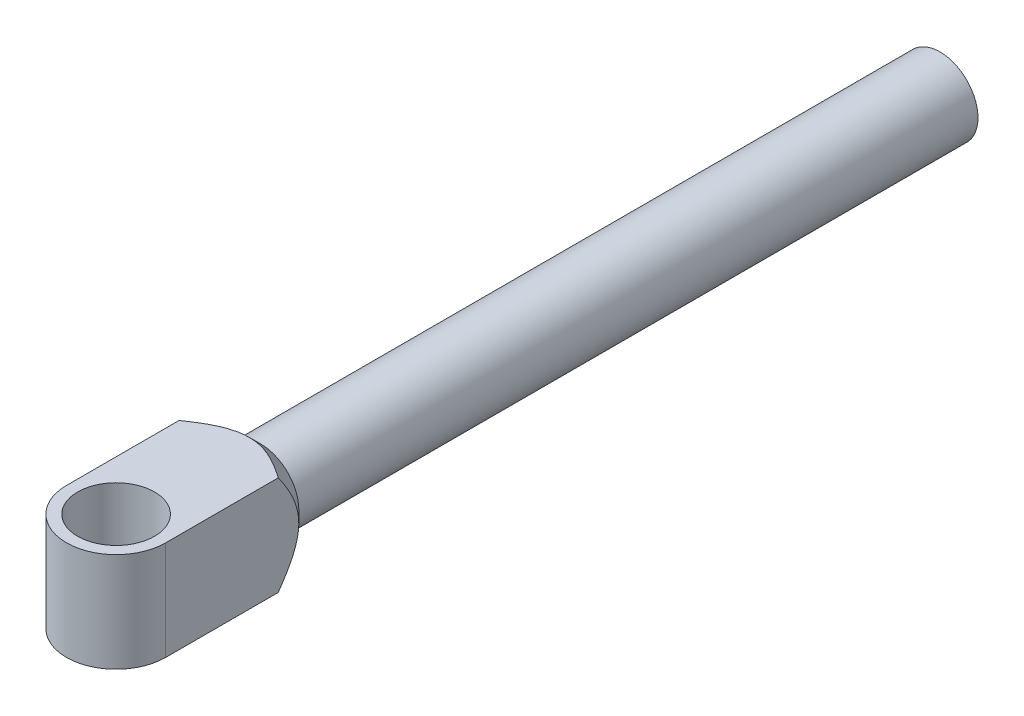
ISO-10303-21;
HEADER;
FILE_DESCRIPTION(('STEP AP214'),'2;1');
FILE_NAME('part.step','',(''),(''),'','','');
FILE_SCHEMA(('AUTOMOTIVE_DESIGN { 1 0 10303 214 1 1 1 1 }'));
ENDSEC;
DATA;
#1=APPLICATION_CONTEXT('core data for automotive mechanical design processes');
#2=APPLICATION_PROTOCOL_DEFINITION('international standard','automotive_design',2000,#1);
#3=PRODUCT_CONTEXT('',#1,'mechanical');
#4=PRODUCT('Part','Part','',(#3));
#5=PRODUCT_RELATED_PRODUCT_CATEGORY('part','',(#4));
#6=PRODUCT_DEFINITION_FORMATION('','',#4);
#7=PRODUCT_DEFINITION_CONTEXT('part definition',#1,'design');
#8=PRODUCT_DEFINITION('design','',#6,#7);
#9=PRODUCT_DEFINITION_SHAPE('','',#8);
#10=(LENGTH_UNIT() NAMED_UNIT(*) SI_UNIT(.MILLI.,.METRE.));
#11=(NAMED_UNIT(*) PLANE_ANGLE_UNIT() SI_UNIT($,.RADIAN.));
#12=(NAMED_UNIT(*) SI_UNIT($,.STERADIAN.) SOLID_ANGLE_UNIT());
#13=UNCERTAINTY_MEASURE_WITH_UNIT(LENGTH_MEASURE(1.E-05),#10,'distance_accuracy_value','');
#14=(GEOMETRIC_REPRESENTATION_CONTEXT(3) GLOBAL_UNCERTAINTY_ASSIGNED_CONTEXT((#13)) GLOBAL_UNIT_ASSIGNED_CONTEXT((#10,
#11,#12)) REPRESENTATION_CONTEXT('',''));
#15=CARTESIAN_POINT('',(0.,0.,0.));
#16=DIRECTION('',(0.,0.,1.));
#17=DIRECTION('',(1.,0.,0.));
#18=AXIS2_PLACEMENT_3D('',#15,#16,#17);
#19=CARTESIAN_POINT('',(356.0840273377,-43.807887528,805.25));
#20=DIRECTION('',(0.,1.,0.));
#21=DIRECTION('',(0.,0.,1.));
#22=AXIS2_PLACEMENT_3D('',#19,#20,#21);
#23=CYLINDRICAL_SURFACE('',#22,11.75);
#24=DIRECTION('',(0.,1.,0.));
#25=VECTOR('',#24,1.);
#26=CARTESIAN_POINT('',(344.3340273377,-43.807887528,805.25));
#27=LINE('',#26,#25);
#28=CARTESIAN_POINT('',(344.3340273377,-67.307887528,805.25));
#29=VERTEX_POINT('',#28);
#30=CARTESIAN_POINT('',(344.3340273377,-43.807887528,805.25));
#31=VERTEX_POINT('',#30);
#32=EDGE_CURVE('E62',#29,#31,#27,.T.);
#33=ORIENTED_EDGE('',*,*,#32,.F.);
#34=CARTESIAN_POINT('',(356.0840273377,-67.307887528,805.25));
#35=DIRECTION('',(0.,1.,0.));
#36=DIRECTION('',(0.,0.,1.));
#37=AXIS2_PLACEMENT_3D('',#34,#35,#36);
#38=CIRCLE('',#37,11.75);
#39=CARTESIAN_POINT('',(367.8340273377,-67.307887528,805.25));
#40=VERTEX_POINT('',#39);
#41=EDGE_CURVE('E20',#40,#29,#38,.F.);
#42=ORIENTED_EDGE('',*,*,#41,.F.);
#43=DIRECTION('',(0.,1.,0.));
#44=VECTOR('',#43,1.);
#45=CARTESIAN_POINT('',(367.8340273377,-43.807887528,805.25));
#46=LINE('',#45,#44);
#47=CARTESIAN_POINT('',(367.8340273377,-43.807887528,805.25));
#48=VERTEX_POINT('',#47);
#49=EDGE_CURVE('E60',#48,#40,#46,.F.);
#50=ORIENTED_EDGE('',*,*,#49,.F.);
#51=CARTESIAN_POINT('',(356.0840273377,-43.807887528,805.25));
#52=DIRECTION('',(0.,1.,0.));
#53=DIRECTION('',(0.,0.,1.));
#54=AXIS2_PLACEMENT_3D('',#51,#52,#53);
#55=CIRCLE('',#54,11.75);
#56=EDGE_CURVE('E146',#48,#31,#55,.F.);
#57=ORIENTED_EDGE('',*,*,#56,.T.);
#58=EDGE_LOOP('',(#33,#42,#50,#57));
#59=FACE_BOUND('',#58,.T.);
#60=ADVANCED_FACE('F17',(#59),#23,.T.);
#61=CARTESIAN_POINT('',(356.0840273377,-43.807887528,805.25));
#62=DIRECTION('',(0.,1.,0.));
#63=DIRECTION('',(0.,0.,1.));
#64=AXIS2_PLACEMENT_3D('',#61,#62,#63);
#65=CYLINDRICAL_SURFACE('',#64,9.1);
#66=CARTESIAN_POINT('',(356.0840273377,-43.807887528,805.25));
#67=DIRECTION('',(0.,1.,0.));
#68=DIRECTION('',(0.,0.,1.));
#69=AXIS2_PLACEMENT_3D('',#66,#67,#68);
#70=CIRCLE('',#69,9.1);
#71=CARTESIAN_POINT('',(356.0840273377,-43.807887528,814.35));
#72=VERTEX_POINT('',#71);
#73=EDGE_CURVE('E115',#72,#72,#70,.T.);
#74=ORIENTED_EDGE('',*,*,#73,.T.);
#75=EDGE_LOOP('',(#74));
#76=FACE_BOUND('',#75,.T.);
#77=CARTESIAN_POINT('',(356.0840273377,-67.307887528,805.25));
#78=DIRECTION('',(0.,1.,0.));
#79=DIRECTION('',(0.,0.,1.));
#80=AXIS2_PLACEMENT_3D('',#77,#78,#79);
#81=CIRCLE('',#80,9.1);
#82=CARTESIAN_POINT('',(356.0840273377,-67.307887528,814.35));
#83=VERTEX_POINT('',#82);
#84=EDGE_CURVE('E64',#83,#83,#81,.T.);
#85=ORIENTED_EDGE('',*,*,#84,.F.);
#86=EDGE_LOOP('',(#85));
#87=FACE_BOUND('',#86,.T.);
#88=ADVANCED_FACE('F123',(#76,#87),#65,.F.);
#89=CARTESIAN_POINT('',(367.8340273377,-43.807887528,771.));
#90=DIRECTION('',(1.,0.,0.));
#91=DIRECTION('',(0.,0.,-1.));
#92=AXIS2_PLACEMENT_3D('',#89,#90,#91);
#93=PLANE('',#92);
#94=DIRECTION('',(0.,0.,-1.));
#95=VECTOR('',#94,1.);
#96=CARTESIAN_POINT('',(367.8340273377,-67.307887528,805.25));
#97=LINE('',#96,#95);
#98=CARTESIAN_POINT('',(367.834027321093,-67.307887528,778.617009345868));
#99=VERTEX_POINT('',#98);
#100=EDGE_CURVE('E65',#99,#40,#97,.F.);
#101=ORIENTED_EDGE('',*,*,#100,.F.);
#102=CARTESIAN_POINT('',(367.8340273377,-43.8078875612225,778.617009334119));
#103=CARTESIAN_POINT('',(367.8340273377,-43.9720833326221,778.500908330046));
#104=CARTESIAN_POINT('',(367.8340273377,-44.1368493574559,778.385614608329));
#105=CARTESIAN_POINT('',(367.8340273377,-44.4676179321151,778.156803513824));
#106=CARTESIAN_POINT('',(367.8340273377,-44.6336205228941,778.043286200257));
#107=CARTESIAN_POINT('',(367.8340273377,-45.1337502628761,777.705558863125));
#108=CARTESIAN_POINT('',(367.8340273377,-45.4698620709718,777.484270918139));
#109=CARTESIAN_POINT('',(367.8340273377,-46.1523873933412,777.048457894456));
#110=CARTESIAN_POINT('',(367.8340273377,-46.4988771451367,776.834051822236));
#111=CARTESIAN_POINT('',(367.8340273377,-47.1989500828415,776.41718586204));
#112=CARTESIAN_POINT('',(367.8340273377,-47.5525324518659,776.214724608797));
#113=CARTESIAN_POINT('',(367.8340273377,-48.2789697696737,775.818450490659));
#114=CARTESIAN_POINT('',(367.8340273377,-48.6520817065143,775.625105489166));
#115=CARTESIAN_POINT('',(367.8340273377,-49.4079900644249,775.258000499855));
#116=CARTESIAN_POINT('',(367.8340273377,-49.7907883084507,775.084244232697));
#117=CARTESIAN_POINT('',(367.8340273377,-50.5647866516525,774.762068885955));
#118=CARTESIAN_POINT('',(367.8340273377,-50.9559356573628,774.613528403155));
#119=CARTESIAN_POINT('',(367.8340273377,-51.7482520592512,774.346535710291));
#120=CARTESIAN_POINT('',(367.8340273377,-52.1494129845447,774.228064592045));
#121=CARTESIAN_POINT('',(367.8340273377,-52.9388530241748,774.032611358954));
#122=CARTESIAN_POINT('',(367.8340273377,-53.3266557858799,773.953732242664));
#123=CARTESIAN_POINT('',(367.8340273377,-54.1081629228043,773.832806782747));
#124=CARTESIAN_POINT('',(367.8340273377,-54.5018685686167,773.790768488305));
#125=CARTESIAN_POINT('',(367.8340273377,-55.2860083098167,773.746718225242));
#126=CARTESIAN_POINT('',(367.8340273377,-55.6764108090465,773.744152968936));
#127=CARTESIAN_POINT('',(367.8340273377,-56.4555109483549,773.777805990125));
#128=CARTESIAN_POINT('',(367.8340273377,-56.8442085802886,773.814024452706));
#129=CARTESIAN_POINT('',(367.8340273377,-57.6137874821791,773.922454559964));
#130=CARTESIAN_POINT('',(367.8340273377,-57.9947037242454,773.994422707268));
#131=CARTESIAN_POINT('',(367.8340273377,-58.7490756171652,774.17010566355));
#132=CARTESIAN_POINT('',(367.8340273377,-59.1225302908825,774.273824601826));
#133=CARTESIAN_POINT('',(367.8340273377,-59.8656022644775,774.509718081289));
#134=CARTESIAN_POINT('',(367.8340273377,-60.235105822663,774.64224642522));
#135=CARTESIAN_POINT('',(367.8340273377,-60.9650138090594,774.930082463414));
#136=CARTESIAN_POINT('',(367.8340273377,-61.3254184370236,775.085389657092));
#137=CARTESIAN_POINT('',(367.8340273377,-62.1858496295716,775.483027140046));
#138=CARTESIAN_POINT('',(367.8340273377,-62.6815509101529,775.734672231708));
#139=CARTESIAN_POINT('',(367.8340273377,-63.6581087042634,776.2656252749));
#140=CARTESIAN_POINT('',(367.8340273377,-64.1389552924735,776.544951218814));
#141=CARTESIAN_POINT('',(367.8340273377,-64.8434715062052,776.975031208894));
#142=CARTESIAN_POINT('',(367.8340273377,-65.0720193785926,777.11789193152));
#143=CARTESIAN_POINT('',(367.8340273377,-65.5263977708657,777.407889673685));
#144=CARTESIAN_POINT('',(367.8340273377,-65.752228224533,777.555026797134));
#145=CARTESIAN_POINT('',(367.8340273377,-66.2010021306323,777.852767507223));
#146=CARTESIAN_POINT('',(367.8340273377,-66.4239500363691,778.003364399849));
#147=CARTESIAN_POINT('',(367.8340273377,-66.8675674098456,778.307834129241));
#148=CARTESIAN_POINT('',(367.8340273377,-67.088237095301,778.461706648591));
#149=CARTESIAN_POINT('',(367.8340273377,-67.3078874725577,778.617009318407));
#150=B_SPLINE_CURVE_WITH_KNOTS('',3,(#102,#103,#104,#105,#106,#107,#108,#109,#110,#111,#112,
#113,#114,#115,#116,#117,#118,#119,#120,#121,#122,#123,#124,#125,#126,#127,#128,#129,#130,#131,
#132,#133,#134,#135,#136,#137,#138,#139,#140,#141,#142,#143,#144,#145,#146,#147,#148,#149),
.UNSPECIFIED.,.F.,.F.,(4,2,2,2,2,2,2,2,2,2,2,2,2,2,2,2,2,2,2,2,2,2,2,4),(0.,0.603284214357325,
1.2065884984303,2.41370212184018,3.63589429711065,4.85794650682781,6.11818126189894,
7.37865498260469,8.63287646281951,9.88630730006657,11.0719629888312,12.2578776616901,
13.4271541596335,14.5964362377234,15.757861137066,16.9194371479008,18.0961771716868,
19.2728913394008,20.9393962384773,22.606991550439,23.4155277449098,24.2240836021656,
25.0311885810214,25.8382157022248),.UNSPECIFIED.);
#151=CARTESIAN_POINT('',(367.8340273377,-43.8078875446113,778.617009345865));
#152=VERTEX_POINT('',#151);
#153=EDGE_CURVE('E109',#152,#99,#150,.T.);
#154=ORIENTED_EDGE('',*,*,#153,.F.);
#155=DIRECTION('',(0.,0.,-1.));
#156=VECTOR('',#155,1.);
#157=CARTESIAN_POINT('',(367.8340273377,-43.807887528,805.25));
#158=LINE('',#157,#156);
#159=EDGE_CURVE('E72',#152,#48,#158,.F.);
#160=ORIENTED_EDGE('',*,*,#159,.T.);
#161=ORIENTED_EDGE('',*,*,#49,.T.);
#162=EDGE_LOOP('',(#101,#154,#160,#161));
#163=FACE_BOUND('',#162,.T.);
#164=ADVANCED_FACE('F68',(#163),#93,.T.);
#165=CARTESIAN_POINT('',(356.0840273377,-67.307887528,805.25));
#166=DIRECTION('',(0.,-1.,0.));
#167=DIRECTION('',(0.,0.,-1.));
#168=AXIS2_PLACEMENT_3D('',#165,#166,#167);
#169=PLANE('',#168);
#170=ORIENTED_EDGE('',*,*,#84,.T.);
#171=EDGE_LOOP('',(#170));
#172=FACE_BOUND('',#171,.T.);
#173=DIRECTION('',(0.,0.,1.));
#174=VECTOR('',#173,1.);
#175=CARTESIAN_POINT('',(344.3340273377,-67.307887528,805.25));
#176=LINE('',#175,#174);
#177=CARTESIAN_POINT('',(344.3340273377,-67.3078875113887,778.617009345865));
#178=VERTEX_POINT('',#177);
#179=EDGE_CURVE('E80',#178,#29,#176,.T.);
#180=ORIENTED_EDGE('',*,*,#179,.F.);
#181=CARTESIAN_POINT('',(367.834027304486,-67.307887528,778.617009334125));
#182=CARTESIAN_POINT('',(367.669933070102,-67.307887528,778.500980121788));
#183=CARTESIAN_POINT('',(367.505269285915,-67.307887528,778.385757198324));
#184=CARTESIAN_POINT('',(367.174706780569,-67.307887528,778.157085403399));
#185=CARTESIAN_POINT('',(367.008808018572,-67.307887528,778.043636590993));
#186=CARTESIAN_POINT('',(366.508989744979,-67.307887528,777.706109037635));
#187=CARTESIAN_POINT('',(366.173088151889,-67.307887528,777.484948498926));
#188=CARTESIAN_POINT('',(365.490919610991,-67.307887528,777.049330191745));
#189=CARTESIAN_POINT('',(365.144575178592,-67.307887528,776.834993368678));
#190=CARTESIAN_POINT('',(364.444802954882,-67.307887528,776.418254494662));
#191=CARTESIAN_POINT('',(364.091376044693,-67.307887528,776.215850971306));
#192=CARTESIAN_POINT('',(363.364879850517,-67.307887528,775.819466045992));
#193=CARTESIAN_POINT('',(362.991544905533,-67.307887528,775.625968253974));
#194=CARTESIAN_POINT('',(362.23516392909,-67.307887528,775.258570942441));
#195=CARTESIAN_POINT('',(361.852115774883,-67.3078875280001,775.084675752936));
#196=CARTESIAN_POINT('',(361.077732145356,-67.307887528,774.762300657036));
#197=CARTESIAN_POINT('',(360.68645075316,-67.3078875279998,774.61369208096));
#198=CARTESIAN_POINT('',(359.893856956771,-67.3078875280002,774.34659637669));
#199=CARTESIAN_POINT('',(359.492552273828,-67.3078875280007,774.22808680325));
#200=CARTESIAN_POINT('',(358.840328320089,-67.3078875279996,774.066590517672));
#201=CARTESIAN_POINT('',(358.592206572544,-67.3078875279987,774.012218255162));
#202=CARTESIAN_POINT('',(358.093104805663,-67.3078875280013,773.918005465115));
#203=CARTESIAN_POINT('',(357.842123891335,-67.3078875280049,773.878169624341));
#204=CARTESIAN_POINT('',(357.34046019726,-67.3078875279951,773.814389991628));
#205=CARTESIAN_POINT('',(357.089795551721,-67.3078875279818,773.790304655479));
#206=CARTESIAN_POINT('',(356.587439587538,-67.3078875280182,773.758105584382));
#207=CARTESIAN_POINT('',(356.335748232605,-67.3078875280678,773.749992418967));
#208=CARTESIAN_POINT('',(355.728643881134,-67.3078875280907,773.750010681215));
#209=CARTESIAN_POINT('',(355.373201544817,-67.3078875280243,773.766207811685));
#210=CARTESIAN_POINT('',(354.665128984257,-67.3078875279757,773.830099611048));
#211=CARTESIAN_POINT('',(354.312499645445,-67.3078875279934,773.877803829791));
#212=CARTESIAN_POINT('',(353.608108364246,-67.3078875280066,774.002957936206));
#213=CARTESIAN_POINT('',(353.256411539075,-67.3078875280018,774.080769754538));
#214=CARTESIAN_POINT('',(352.559969887627,-67.3078875279982,774.262478842406));
#215=CARTESIAN_POINT('',(352.215224082461,-67.3078875279995,774.366372410823));
#216=CARTESIAN_POINT('',(351.527520729525,-67.3078875280005,774.598318933937));
#217=CARTESIAN_POINT('',(351.18469256407,-67.3078875280001,774.726751579666));
#218=CARTESIAN_POINT('',(350.506777109838,-67.3078875279999,775.002780723428));
#219=CARTESIAN_POINT('',(350.171692482352,-67.307887528,775.150383697826));
#220=CARTESIAN_POINT('',(349.508113658266,-67.307887528,775.461762968168));
#221=CARTESIAN_POINT('',(349.179638858231,-67.307887528,775.625580310058));
#222=CARTESIAN_POINT('',(348.529591125651,-67.307887528,775.966223017526));
#223=CARTESIAN_POINT('',(348.208017417846,-67.307887528,776.143046911976));
#224=CARTESIAN_POINT('',(347.582399180066,-67.307887528,776.500921750887));
#225=CARTESIAN_POINT('',(347.27813858683,-67.307887528,776.681596783741));
#226=CARTESIAN_POINT('',(346.674706935308,-67.307887528,777.05127801984));
#227=CARTESIAN_POINT('',(346.375536243533,-67.307887528,777.240284819545));
#228=CARTESIAN_POINT('',(345.78368982917,-67.307887528,777.623986119928));
#229=CARTESIAN_POINT('',(345.490984220635,-67.307887528,777.818634684184));
#230=CARTESIAN_POINT('',(344.909618348349,-67.307887528,778.213723498896));
#231=CARTESIAN_POINT('',(344.62095702089,-67.307887528,778.414162182321));
#232=CARTESIAN_POINT('',(344.334027393157,-67.307887528,778.617009318397));
#233=B_SPLINE_CURVE_WITH_KNOTS('',3,(#181,#182,#183,#184,#185,#186,#187,#188,#189,#190,#191,
#192,#193,#194,#195,#196,#197,#198,#199,#200,#201,#202,#203,#204,#205,#206,#207,#208,#209,#210,
#211,#212,#213,#214,#215,#216,#217,#218,#219,#220,#221,#222,#223,#224,#225,#226,#227,#228,#229,
#230,#231,#232),.UNSPECIFIED.,.F.,.F.,(4,2,2,2,2,2,2,2,2,2,2,2,2,2,2,2,2,2,2,2,2,2,2,2,2,4),(0.,
0.602911158987478,1.20584234416441,2.41221932281855,3.63393189912737,4.85549341582281,
6.11653465446755,7.37785390049196,8.63254948641551,9.88630666282796,10.6479618404222,
11.4098623706987,12.1648182843541,12.919801117619,13.9856975702539,15.0519172462202,
16.1313737011771,17.2106770629168,18.3082766206493,19.4062479527894,20.5070735190299,
21.6077747654108,22.6692041275176,23.7307095996729,24.7851878108633,25.8393832650637),.UNSPECIFIED.);
#234=EDGE_CURVE('E76',#99,#178,#233,.T.);
#235=ORIENTED_EDGE('',*,*,#234,.F.);
#236=ORIENTED_EDGE('',*,*,#100,.T.);
#237=ORIENTED_EDGE('',*,*,#41,.T.);
#238=EDGE_LOOP('',(#180,#235,#236,#237));
#239=FACE_BOUND('',#238,.T.);
#240=ADVANCED_FACE('F74',(#172,#239),#169,.T.);
#241=CARTESIAN_POINT('',(344.3340273377,-43.807887528,805.25));
#242=DIRECTION('',(-1.,0.,0.));
#243=DIRECTION('',(0.,0.,1.));
#244=AXIS2_PLACEMENT_3D('',#241,#242,#243);
#245=PLANE('',#244);
#246=DIRECTION('',(0.,0.,-1.));
#247=VECTOR('',#246,1.);
#248=CARTESIAN_POINT('',(344.3340273377,-43.807887528,805.25));
#249=LINE('',#248,#247);
#250=CARTESIAN_POINT('',(344.334027354307,-43.807887528,778.617009345868));
#251=VERTEX_POINT('',#250);
#252=EDGE_CURVE('E35',#31,#251,#249,.T.);
#253=ORIENTED_EDGE('',*,*,#252,.T.);
#254=CARTESIAN_POINT('',(344.3340273377,-67.3078874947775,778.617009334119));
#255=CARTESIAN_POINT('',(344.3340273377,-67.1436917233779,778.500908330046));
#256=CARTESIAN_POINT('',(344.3340273377,-66.978925698544,778.385614608329));
#257=CARTESIAN_POINT('',(344.3340273377,-66.6481571238849,778.156803513824));
#258=CARTESIAN_POINT('',(344.3340273377,-66.4821545331058,778.043286200257));
#259=CARTESIAN_POINT('',(344.3340273377,-65.9820247931239,777.705558863125));
#260=CARTESIAN_POINT('',(344.3340273377,-65.6459129850282,777.484270918139));
#261=CARTESIAN_POINT('',(344.3340273377,-64.9633876626588,777.048457894456));
#262=CARTESIAN_POINT('',(344.3340273377,-64.6168979108633,776.834051822236));
#263=CARTESIAN_POINT('',(344.3340273377,-63.9168249731585,776.41718586204));
#264=CARTESIAN_POINT('',(344.3340273377,-63.5632426041341,776.214724608797));
#265=CARTESIAN_POINT('',(344.3340273377,-62.8368052863263,775.818450490659));
#266=CARTESIAN_POINT('',(344.3340273377,-62.4636933494857,775.625105489166));
#267=CARTESIAN_POINT('',(344.3340273377,-61.7077849915751,775.258000499855));
#268=CARTESIAN_POINT('',(344.3340273377,-61.3249867475493,775.084244232697));
#269=CARTESIAN_POINT('',(344.3340273377,-60.5509884043475,774.762068885955));
#270=CARTESIAN_POINT('',(344.3340273377,-60.1598393986372,774.613528403155));
#271=CARTESIAN_POINT('',(344.3340273377,-59.3675229967488,774.346535710291));
#272=CARTESIAN_POINT('',(344.3340273377,-58.9663620714553,774.228064592045));
#273=CARTESIAN_POINT('',(344.3340273377,-58.1769220318252,774.032611358953));
#274=CARTESIAN_POINT('',(344.3340273377,-57.7891192701201,773.953732242664));
#275=CARTESIAN_POINT('',(344.3340273377,-57.0076121331958,773.832806782746));
#276=CARTESIAN_POINT('',(344.3340273377,-56.6139064873833,773.790768488305));
#277=CARTESIAN_POINT('',(344.3340273377,-55.8297667461834,773.746718225242));
#278=CARTESIAN_POINT('',(344.3340273377,-55.4393642469536,773.744152968936));
#279=CARTESIAN_POINT('',(344.3340273377,-54.6602641076451,773.777805990125));
#280=CARTESIAN_POINT('',(344.3340273377,-54.2715664757114,773.814024452706));
#281=CARTESIAN_POINT('',(344.3340273377,-53.501987573821,773.922454559963));
#282=CARTESIAN_POINT('',(344.3340273377,-53.1210713317546,773.994422707268));
#283=CARTESIAN_POINT('',(344.3340273377,-52.3666994388349,774.17010566355));
#284=CARTESIAN_POINT('',(344.3340273377,-51.9932447651176,774.273824601826));
#285=CARTESIAN_POINT('',(344.3340273377,-51.2501727915226,774.509718081289));
#286=CARTESIAN_POINT('',(344.3340273377,-50.880669233337,774.642246425219));
#287=CARTESIAN_POINT('',(344.3340273377,-50.1507612469407,774.930082463414));
#288=CARTESIAN_POINT('',(344.3340273377,-49.7903566189765,775.085389657092));
#289=CARTESIAN_POINT('',(344.3340273377,-48.9299254264285,775.483027140046));
#290=CARTESIAN_POINT('',(344.3340273377,-48.4342241458471,775.734672231708));
#291=CARTESIAN_POINT('',(344.3340273377,-47.4576663517366,776.2656252749));
#292=CARTESIAN_POINT('',(344.3340273377,-46.9768197635265,776.544951218814));
#293=CARTESIAN_POINT('',(344.3340273377,-46.2723035497949,776.975031208894));
#294=CARTESIAN_POINT('',(344.3340273377,-46.0437556774075,777.11789193152));
#295=CARTESIAN_POINT('',(344.3340273377,-45.5893772851343,777.407889673685));
#296=CARTESIAN_POINT('',(344.3340273377,-45.363546831467,777.555026797134));
#297=CARTESIAN_POINT('',(344.3340273377,-44.9147729253678,777.852767507222));
#298=CARTESIAN_POINT('',(344.3340273377,-44.691825019631,778.003364399849));
#299=CARTESIAN_POINT('',(344.3340273377,-44.2482076461545,778.307834129241));
#300=CARTESIAN_POINT('',(344.3340273377,-44.0275379606991,778.461706648591));
#301=CARTESIAN_POINT('',(344.3340273377,-43.8078875834423,778.617009318407));
#302=B_SPLINE_CURVE_WITH_KNOTS('',3,(#254,#255,#256,#257,#258,#259,#260,#261,#262,#263,#264,
#265,#266,#267,#268,#269,#270,#271,#272,#273,#274,#275,#276,#277,#278,#279,#280,#281,#282,#283,
#284,#285,#286,#287,#288,#289,#290,#291,#292,#293,#294,#295,#296,#297,#298,#299,#300,#301),
.UNSPECIFIED.,.F.,.F.,(4,2,2,2,2,2,2,2,2,2,2,2,2,2,2,2,2,2,2,2,2,2,2,4),(0.,0.603284214357342,
1.20658849843029,2.41370212184018,3.63589429711065,4.85794650682779,6.11818126189892,
7.37865498260473,8.63287646281954,9.88630730006655,11.0719629888312,12.25787766169,
13.4271541596334,14.5964362377233,15.7578611370659,16.9194371479007,18.0961771716867,
19.2728913394007,20.9393962384772,22.6069915504389,23.4155277449098,24.2240836021655,
25.0311885810213,25.8382157022248),.UNSPECIFIED.);
#303=EDGE_CURVE('E90',#178,#251,#302,.T.);
#304=ORIENTED_EDGE('',*,*,#303,.F.);
#305=ORIENTED_EDGE('',*,*,#179,.T.);
#306=ORIENTED_EDGE('',*,*,#32,.T.);
#307=EDGE_LOOP('',(#253,#304,#305,#306));
#308=FACE_BOUND('',#307,.T.);
#309=ADVANCED_FACE('F150',(#308),#245,.T.);
#310=CARTESIAN_POINT('',(356.0840273377,-43.807887528,805.25));
#311=DIRECTION('',(0.,-1.,0.));
#312=DIRECTION('',(0.,0.,-1.));
#313=AXIS2_PLACEMENT_3D('',#310,#311,#312);
#314=PLANE('',#313);
#315=ORIENTED_EDGE('',*,*,#73,.F.);
#316=EDGE_LOOP('',(#315));
#317=FACE_BOUND('',#316,.T.);
#318=ORIENTED_EDGE('',*,*,#56,.F.);
#319=ORIENTED_EDGE('',*,*,#159,.F.);
#320=CARTESIAN_POINT('',(344.334027370914,-43.807887528,778.617009334125));
#321=CARTESIAN_POINT('',(344.498121605299,-43.807887528,778.500980121787));
#322=CARTESIAN_POINT('',(344.662785389487,-43.807887528,778.385757198322));
#323=CARTESIAN_POINT('',(344.993347894836,-43.807887528,778.157085403396));
#324=CARTESIAN_POINT('',(345.159246656834,-43.807887528,778.043636590989));
#325=CARTESIAN_POINT('',(345.65906493043,-43.807887528,777.706109037628));
#326=CARTESIAN_POINT('',(345.994966523523,-43.807887528,777.484948498918));
#327=CARTESIAN_POINT('',(346.677135064425,-43.807887528,777.049330191735));
#328=CARTESIAN_POINT('',(347.023479496826,-43.807887528,776.834993368666));
#329=CARTESIAN_POINT('',(347.72325172054,-43.807887528,776.418254494649));
#330=CARTESIAN_POINT('',(348.07667863073,-43.807887528,776.215850971293));
#331=CARTESIAN_POINT('',(348.803174824907,-43.807887528,775.819466045979));
#332=CARTESIAN_POINT('',(349.176509769889,-43.807887528,775.625968253963));
#333=CARTESIAN_POINT('',(349.932890746327,-43.807887528,775.258570942433));
#334=CARTESIAN_POINT('',(350.315938900531,-43.807887528,775.08467575293));
#335=CARTESIAN_POINT('',(351.090322530053,-43.807887528,774.762300657032));
#336=CARTESIAN_POINT('',(351.481603922248,-43.807887528,774.613692080957));
#337=CARTESIAN_POINT('',(352.274197718633,-43.807887528,774.346596376689));
#338=CARTESIAN_POINT('',(352.675502401574,-43.807887528,774.22808680325));
#339=CARTESIAN_POINT('',(353.327726355311,-43.807887528,774.066590517671));
#340=CARTESIAN_POINT('',(353.575848102856,-43.807887528,774.012218255161));
#341=CARTESIAN_POINT('',(354.074949869739,-43.807887528,773.918005465115));
#342=CARTESIAN_POINT('',(354.325930784066,-43.807887528,773.878169624342));
#343=CARTESIAN_POINT('',(354.827594478142,-43.807887528,773.814389991626));
#344=CARTESIAN_POINT('',(355.078259123682,-43.807887528,773.790304655472));
#345=CARTESIAN_POINT('',(355.580615087866,-43.807887528,773.758105584389));
#346=CARTESIAN_POINT('',(355.832306442801,-43.807887528,773.749992418995));
#347=CARTESIAN_POINT('',(356.439410794275,-43.807887528,773.750010681253));
#348=CARTESIAN_POINT('',(356.794853130593,-43.807887528,773.766207811696));
#349=CARTESIAN_POINT('',(357.502925691153,-43.807887528,773.830099611039));
#350=CARTESIAN_POINT('',(357.855555029963,-43.807887528,773.87780382979));
#351=CARTESIAN_POINT('',(358.559946311161,-43.807887528,774.00295793621));
#352=CARTESIAN_POINT('',(358.91164313633,-43.807887528,774.08076975454));
#353=CARTESIAN_POINT('',(359.608084787775,-43.807887528,774.262478842405));
#354=CARTESIAN_POINT('',(359.95283059294,-43.807887528,774.366372410823));
#355=CARTESIAN_POINT('',(360.640533945874,-43.807887528,774.598318933936));
#356=CARTESIAN_POINT('',(360.983362111328,-43.807887528,774.726751579666));
#357=CARTESIAN_POINT('',(361.661277565557,-43.807887528,775.002780723426));
#358=CARTESIAN_POINT('',(361.996362193042,-43.807887528,775.150383697823));
#359=CARTESIAN_POINT('',(362.659941017124,-43.807887528,775.461762968163));
#360=CARTESIAN_POINT('',(362.988415817158,-43.807887528,775.625580310052));
#361=CARTESIAN_POINT('',(363.638463549734,-43.807887528,775.966223017518));
#362=CARTESIAN_POINT('',(363.960037257538,-43.807887528,776.143046911967));
#363=CARTESIAN_POINT('',(364.585655495318,-43.807887528,776.500921750878));
#364=CARTESIAN_POINT('',(364.889916088555,-43.807887528,776.681596783732));
#365=CARTESIAN_POINT('',(365.493347740079,-43.807887528,777.051278019832));
#366=CARTESIAN_POINT('',(365.792518431856,-43.807887528,777.240284819538));
#367=CARTESIAN_POINT('',(366.384364846222,-43.807887528,777.623986119922));
#368=CARTESIAN_POINT('',(366.677070454758,-43.807887528,777.81863468418));
#369=CARTESIAN_POINT('',(367.258436327048,-43.807887528,778.213723498893));
#370=CARTESIAN_POINT('',(367.547097654509,-43.807887528,778.41416218232));
#371=CARTESIAN_POINT('',(367.834027282243,-43.807887528,778.617009318397));
#372=B_SPLINE_CURVE_WITH_KNOTS('',3,(#320,#321,#322,#323,#324,#325,#326,#327,#328,#329,#330,
#331,#332,#333,#334,#335,#336,#337,#338,#339,#340,#341,#342,#343,#344,#345,#346,#347,#348,#349,
#350,#351,#352,#353,#354,#355,#356,#357,#358,#359,#360,#361,#362,#363,#364,#365,#366,#367,#368,
#369,#370,#371),.UNSPECIFIED.,.F.,.F.,(4,2,2,2,2,2,2,2,2,2,2,2,2,2,2,2,2,2,2,2,2,2,2,2,2,4),(0.,
0.602911158991835,1.20584234417312,2.41221932283592,3.63393189915081,4.85549341585232,
6.11653465448879,7.37785390050449,8.63254948642177,9.88630666282787,10.6479618404234,
11.4098623706999,12.1648182843573,12.9198011176258,13.9856975702618,15.0519172462261,
16.1313737011777,17.2106770629143,18.3082766206427,19.4062479527784,20.507073519013,
21.607774765388,22.6692041274989,23.7307095996582,24.7851878108546,25.8393832650612),.UNSPECIFIED.);
#373=EDGE_CURVE('E83',#251,#152,#372,.T.);
#374=ORIENTED_EDGE('',*,*,#373,.F.);
#375=ORIENTED_EDGE('',*,*,#252,.F.);
#376=EDGE_LOOP('',(#318,#319,#374,#375));
#377=FACE_BOUND('',#376,.T.);
#378=ADVANCED_FACE('F96',(#317,#377),#314,.F.);
#379=CARTESIAN_POINT('',(356.0840273377,-55.557887528,778.66271135464));
#380=DIRECTION('',(0.,0.,1.));
#381=DIRECTION('',(0.,-1.,0.));
#382=AXIS2_PLACEMENT_3D('',#379,#380,#381);
#383=CONICAL_SURFACE('',#382,16.6627113548312,0.785398162499989);
#384=CARTESIAN_POINT('',(356.0840273377,-55.557887528,771.));
#385=DIRECTION('',(0.,0.,1.));
#386=DIRECTION('',(1.,0.,0.));
#387=AXIS2_PLACEMENT_3D('',#384,#385,#386);
#388=CIRCLE('',#387,9.);
#389=CARTESIAN_POINT('',(365.0840273377,-55.557887528,771.));
#390=VERTEX_POINT('',#389);
#391=EDGE_CURVE('E26',#390,#390,#388,.F.);
#392=ORIENTED_EDGE('',*,*,#391,.F.);
#393=EDGE_LOOP('',(#392));
#394=FACE_BOUND('',#393,.T.);
#395=ORIENTED_EDGE('',*,*,#303,.T.);
#396=ORIENTED_EDGE('',*,*,#373,.T.);
#397=ORIENTED_EDGE('',*,*,#153,.T.);
#398=ORIENTED_EDGE('',*,*,#234,.T.);
#399=EDGE_LOOP('',(#395,#396,#397,#398));
#400=FACE_BOUND('',#399,.T.);
#401=ADVANCED_FACE('F98',(#394,#400),#383,.T.);
#402=CARTESIAN_POINT('',(356.0840273377,-55.557887528,610.25));
#403=DIRECTION('',(0.,0.,-1.));
#404=DIRECTION('',(-1.,0.,0.));
#405=AXIS2_PLACEMENT_3D('',#402,#403,#404);
#406=PLANE('',#405);
#407=CARTESIAN_POINT('',(356.0840273377,-55.557887528,610.25));
#408=DIRECTION('',(0.,0.,1.));
#409=DIRECTION('',(1.,0.,0.));
#410=AXIS2_PLACEMENT_3D('',#407,#408,#409);
#411=CIRCLE('',#410,9.);
#412=CARTESIAN_POINT('',(365.0840273377,-55.557887528,610.25));
#413=VERTEX_POINT('',#412);
#414=EDGE_CURVE('E11',#413,#413,#411,.T.);
#415=ORIENTED_EDGE('',*,*,#414,.F.);
#416=EDGE_LOOP('',(#415));
#417=FACE_BOUND('',#416,.T.);
#418=ADVANCED_FACE('F102',(#417),#406,.T.);
#419=CARTESIAN_POINT('',(356.0840273377,-55.557887528,612.));
#420=DIRECTION('',(0.,0.,1.));
#421=DIRECTION('',(1.,0.,0.));
#422=AXIS2_PLACEMENT_3D('',#419,#420,#421);
#423=CYLINDRICAL_SURFACE('',#422,9.);
#424=ORIENTED_EDGE('',*,*,#391,.T.);
#425=EDGE_LOOP('',(#424));
#426=FACE_BOUND('',#425,.T.);
#427=ORIENTED_EDGE('',*,*,#414,.T.);
#428=EDGE_LOOP('',(#427));
#429=FACE_BOUND('',#428,.T.);
#430=ADVANCED_FACE('F133',(#426,#429),#423,.T.);
#431=CLOSED_SHELL('',(#60,#88,#164,#240,#309,#378,#401,#418,#430));
#432=MANIFOLD_SOLID_BREP('B1',#431);
#433=ADVANCED_BREP_SHAPE_REPRESENTATION('',(#18,#432),#14);
#434=SHAPE_DEFINITION_REPRESENTATION(#9,#433);
ENDSEC;
END-ISO-10303-21;
